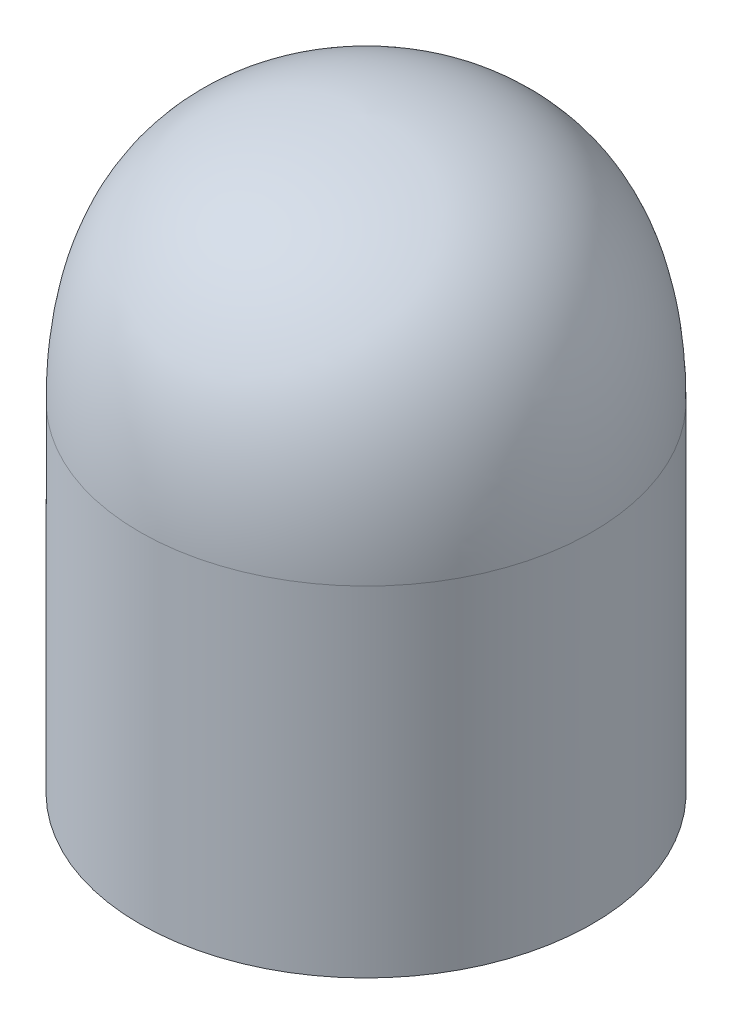
ISO-10303-21;
HEADER;
FILE_DESCRIPTION(('STEP AP214'),'2;1');
FILE_NAME('part.step','',(''),(''),'','','');
FILE_SCHEMA(('AUTOMOTIVE_DESIGN { 1 0 10303 214 1 1 1 1 }'));
ENDSEC;
DATA;
#1=APPLICATION_CONTEXT('core data for automotive mechanical design processes');
#2=APPLICATION_PROTOCOL_DEFINITION('international standard','automotive_design',2000,#1);
#3=PRODUCT_CONTEXT('',#1,'mechanical');
#4=PRODUCT('Part','Part','',(#3));
#5=PRODUCT_RELATED_PRODUCT_CATEGORY('part','',(#4));
#6=PRODUCT_DEFINITION_FORMATION('','',#4);
#7=PRODUCT_DEFINITION_CONTEXT('part definition',#1,'design');
#8=PRODUCT_DEFINITION('design','',#6,#7);
#9=PRODUCT_DEFINITION_SHAPE('','',#8);
#10=(LENGTH_UNIT() NAMED_UNIT(*) SI_UNIT(.MILLI.,.METRE.));
#11=(NAMED_UNIT(*) PLANE_ANGLE_UNIT() SI_UNIT($,.RADIAN.));
#12=(NAMED_UNIT(*) SI_UNIT($,.STERADIAN.) SOLID_ANGLE_UNIT());
#13=UNCERTAINTY_MEASURE_WITH_UNIT(LENGTH_MEASURE(1.E-05),#10,'distance_accuracy_value','');
#14=(GEOMETRIC_REPRESENTATION_CONTEXT(3) GLOBAL_UNCERTAINTY_ASSIGNED_CONTEXT((#13)) GLOBAL_UNIT_ASSIGNED_CONTEXT((#10,
#11,#12)) REPRESENTATION_CONTEXT('',''));
#15=CARTESIAN_POINT('',(0.,0.,0.));
#16=DIRECTION('',(0.,0.,1.));
#17=DIRECTION('',(1.,0.,0.));
#18=AXIS2_PLACEMENT_3D('',#15,#16,#17);
#19=CARTESIAN_POINT('',(0.,0.,0.));
#20=DIRECTION('',(0.,1.,0.));
#21=DIRECTION('',(0.,0.,1.));
#22=AXIS2_PLACEMENT_3D('',#19,#20,#21);
#23=PLANE('',#22);
#24=CARTESIAN_POINT('',(0.,0.,0.));
#25=DIRECTION('',(0.,1.,0.));
#26=DIRECTION('',(0.,0.,1.));
#27=AXIS2_PLACEMENT_3D('',#24,#25,#26);
#28=CIRCLE('',#27,50.);
#29=CARTESIAN_POINT('',(0.,0.,50.));
#30=VERTEX_POINT('',#29);
#31=EDGE_CURVE('E45',#30,#30,#28,.T.);
#32=ORIENTED_EDGE('',*,*,#31,.F.);
#33=EDGE_LOOP('',(#32));
#34=FACE_BOUND('',#33,.T.);
#35=CARTESIAN_POINT('',(0.,0.,0.));
#36=DIRECTION('',(0.,1.,0.));
#37=DIRECTION('',(0.,0.,1.));
#38=AXIS2_PLACEMENT_3D('',#35,#36,#37);
#39=CIRCLE('',#38,48.);
#40=CARTESIAN_POINT('',(0.,0.,48.));
#41=VERTEX_POINT('',#40);
#42=EDGE_CURVE('E67',#41,#41,#39,.T.);
#43=ORIENTED_EDGE('',*,*,#42,.T.);
#44=EDGE_LOOP('',(#43));
#45=FACE_BOUND('',#44,.T.);
#46=ADVANCED_FACE('F41',(#34,#45),#23,.F.);
#47=CARTESIAN_POINT('',(0.,75.,0.));
#48=DIRECTION('',(0.,-1.,0.));
#49=DIRECTION('',(0.,0.,-1.));
#50=AXIS2_PLACEMENT_3D('',#47,#48,#49);
#51=CYLINDRICAL_SURFACE('',#50,50.);
#52=CARTESIAN_POINT('',(0.,75.,0.));
#53=DIRECTION('',(0.,1.,0.));
#54=DIRECTION('',(0.,0.,1.));
#55=AXIS2_PLACEMENT_3D('',#52,#53,#54);
#56=CIRCLE('',#55,50.);
#57=CARTESIAN_POINT('',(0.,75.,50.));
#58=VERTEX_POINT('',#57);
#59=EDGE_CURVE('E11',#58,#58,#56,.T.);
#60=ORIENTED_EDGE('',*,*,#59,.F.);
#61=EDGE_LOOP('',(#60));
#62=FACE_BOUND('',#61,.T.);
#63=ORIENTED_EDGE('',*,*,#31,.T.);
#64=EDGE_LOOP('',(#63));
#65=FACE_BOUND('',#64,.T.);
#66=ADVANCED_FACE('F43',(#62,#65),#51,.T.);
#67=CARTESIAN_POINT('',(0.,75.,0.));
#68=DIRECTION('',(0.,-1.,0.));
#69=DIRECTION('',(0.,0.,-1.));
#70=AXIS2_PLACEMENT_3D('',#67,#68,#69);
#71=CYLINDRICAL_SURFACE('',#70,48.);
#72=CARTESIAN_POINT('',(0.,75.,0.));
#73=DIRECTION('',(0.,-1.,0.));
#74=DIRECTION('',(0.,0.,-1.));
#75=AXIS2_PLACEMENT_3D('',#72,#73,#74);
#76=CIRCLE('',#75,48.);
#77=CARTESIAN_POINT('',(0.,75.,-48.));
#78=VERTEX_POINT('',#77);
#79=EDGE_CURVE('E64',#78,#78,#76,.T.);
#80=ORIENTED_EDGE('',*,*,#79,.F.);
#81=EDGE_LOOP('',(#80));
#82=FACE_BOUND('',#81,.T.);
#83=ORIENTED_EDGE('',*,*,#42,.F.);
#84=EDGE_LOOP('',(#83));
#85=FACE_BOUND('',#84,.T.);
#86=ADVANCED_FACE('F60',(#82,#85),#71,.F.);
#87=CARTESIAN_POINT('',(-48.,75.,0.));
#88=CARTESIAN_POINT('',(-47.1120172532716,108.937680450445,0.));
#89=CARTESIAN_POINT('',(-31.0111974937745,127.280282941691,0.));
#90=CARTESIAN_POINT('',(0.,128.,0.));
#91=B_SPLINE_CURVE_WITH_KNOTS('',3,(#87,#88,#89,#90),.UNSPECIFIED.,.F.,.F.,(4,4),(0.,1.),.UNSPECIFIED.);
#92=CARTESIAN_POINT('',(0.,75.,0.));
#93=DIRECTION('',(0.,-1.,0.));
#94=AXIS1_PLACEMENT('',#92,#93);
#95=SURFACE_OF_REVOLUTION('',#91,#94);
#96=CARTESIAN_POINT('',(0.,128.,0.));
#97=VERTEX_POINT('',#96);
#98=VERTEX_LOOP('',#97);
#99=FACE_BOUND('',#98,.T.);
#100=ORIENTED_EDGE('',*,*,#79,.T.);
#101=EDGE_LOOP('',(#100));
#102=FACE_BOUND('',#101,.T.);
#103=ADVANCED_FACE('F56',(#99,#102),#95,.T.);
#104=CARTESIAN_POINT('',(0.,130.,0.));
#105=CARTESIAN_POINT('',(-30.8315812614232,129.146665144237,0.));
#106=CARTESIAN_POINT('',(-49.9729981022931,112.870317104622,0.));
#107=CARTESIAN_POINT('',(-50.,75.,0.));
#108=B_SPLINE_CURVE_WITH_KNOTS('',3,(#104,#105,#106,#107),.UNSPECIFIED.,.F.,.F.,(4,4),(0.,1.),.UNSPECIFIED.);
#109=CARTESIAN_POINT('',(0.,75.,0.));
#110=DIRECTION('',(0.,-1.,0.));
#111=AXIS1_PLACEMENT('',#109,#110);
#112=SURFACE_OF_REVOLUTION('',#108,#111);
#113=ORIENTED_EDGE('',*,*,#59,.T.);
#114=EDGE_LOOP('',(#113));
#115=FACE_BOUND('',#114,.T.);
#116=CARTESIAN_POINT('',(0.,130.,0.));
#117=VERTEX_POINT('',#116);
#118=VERTEX_LOOP('',#117);
#119=FACE_BOUND('',#118,.T.);
#120=ADVANCED_FACE('F59',(#115,#119),#112,.T.);
#121=CLOSED_SHELL('',(#46,#66,#86,#103,#120));
#122=MANIFOLD_SOLID_BREP('B2',#121);
#123=ADVANCED_BREP_SHAPE_REPRESENTATION('',(#18,#122),#14);
#124=SHAPE_DEFINITION_REPRESENTATION(#9,#123);
ENDSEC;
END-ISO-10303-21;
